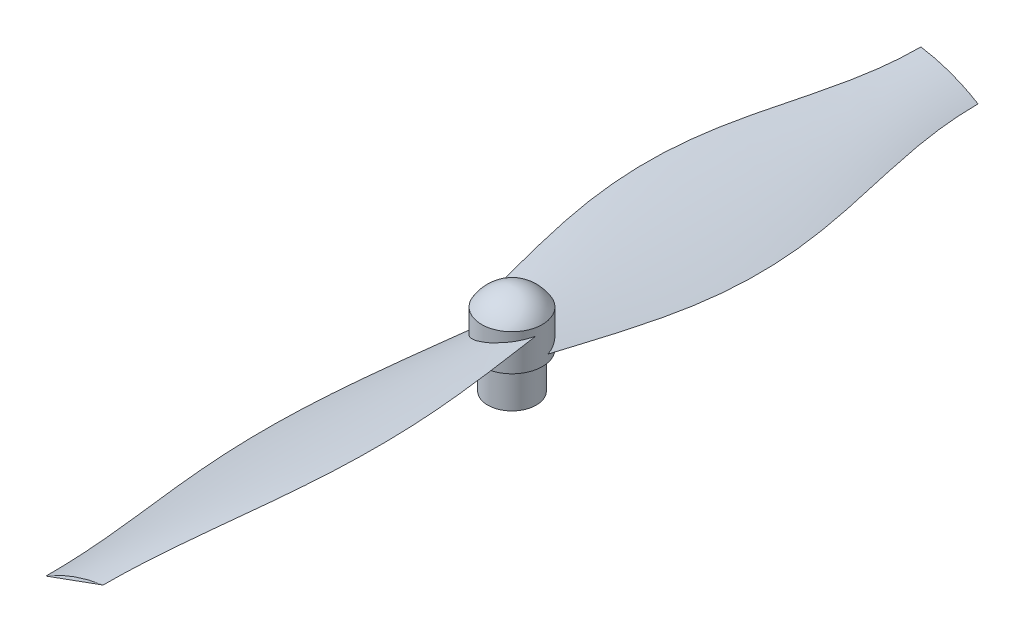
ISO-10303-21;
HEADER;
FILE_DESCRIPTION(('STEP AP214'),'2;1');
FILE_NAME('part.step','',(''),(''),'','','');
FILE_SCHEMA(('AUTOMOTIVE_DESIGN { 1 0 10303 214 1 1 1 1 }'));
ENDSEC;
DATA;
#1=APPLICATION_CONTEXT('core data for automotive mechanical design processes');
#2=APPLICATION_PROTOCOL_DEFINITION('international standard','automotive_design',2000,#1);
#3=PRODUCT_CONTEXT('',#1,'mechanical');
#4=PRODUCT('Part','Part','',(#3));
#5=PRODUCT_RELATED_PRODUCT_CATEGORY('part','',(#4));
#6=PRODUCT_DEFINITION_FORMATION('','',#4);
#7=PRODUCT_DEFINITION_CONTEXT('part definition',#1,'design');
#8=PRODUCT_DEFINITION('design','',#6,#7);
#9=PRODUCT_DEFINITION_SHAPE('','',#8);
#10=(LENGTH_UNIT() NAMED_UNIT(*) SI_UNIT(.MILLI.,.METRE.));
#11=(NAMED_UNIT(*) PLANE_ANGLE_UNIT() SI_UNIT($,.RADIAN.));
#12=(NAMED_UNIT(*) SI_UNIT($,.STERADIAN.) SOLID_ANGLE_UNIT());
#13=UNCERTAINTY_MEASURE_WITH_UNIT(LENGTH_MEASURE(1.E-05),#10,'distance_accuracy_value','');
#14=(GEOMETRIC_REPRESENTATION_CONTEXT(3) GLOBAL_UNCERTAINTY_ASSIGNED_CONTEXT((#13)) GLOBAL_UNIT_ASSIGNED_CONTEXT((#10,
#11,#12)) REPRESENTATION_CONTEXT('',''));
#15=CARTESIAN_POINT('',(0.,0.,0.));
#16=DIRECTION('',(0.,0.,1.));
#17=DIRECTION('',(1.,0.,0.));
#18=AXIS2_PLACEMENT_3D('',#15,#16,#17);
#19=CARTESIAN_POINT('',(4.69846310392955,7.28989928337167,0.));
#20=DIRECTION('',(-0.342020143325666,-0.939692620785909,0.));
#21=DIRECTION('',(-0.939692620785909,0.342020143325666,0.));
#22=AXIS2_PLACEMENT_3D('',#19,#20,#21);
#23=PLANE('',#22);
#24=DIRECTION('',(-0.93969262078591,0.342020143325666,0.));
#25=VECTOR('',#24,1.);
#26=CARTESIAN_POINT('',(0.,9.,0.));
#27=LINE('',#26,#25);
#28=CARTESIAN_POINT('',(4.69846310392955,7.28989928337167,0.));
#29=VERTEX_POINT('',#28);
#30=CARTESIAN_POINT('',(-4.69846310392955,10.7101007166283,0.));
#31=VERTEX_POINT('',#30);
#32=EDGE_CURVE('E104',#29,#31,#27,.T.);
#33=ORIENTED_EDGE('',*,*,#32,.T.);
#34=CARTESIAN_POINT('',(-4.69846310392955,10.7101007166283,0.));
#35=CARTESIAN_POINT('',(-4.69846310392955,10.7101007166283,-0.679869268479037));
#36=CARTESIAN_POINT('',(-14.0317929907433,14.1071549820155,-38.1938255790195));
#37=CARTESIAN_POINT('',(-4.69846310392955,10.7101007166283,-54.6154602527929));
#38=CARTESIAN_POINT('',(-4.69846310392955,10.7101007166283,-72.));
#39=B_SPLINE_CURVE_WITH_KNOTS('',3,(#34,#35,#36,#37,#38),.UNSPECIFIED.,.F.,.F.,(4,1,4),(0.,
0.279461519936665,1.),.UNSPECIFIED.);
#40=CARTESIAN_POINT('',(-4.69846310392955,10.7101007166283,-72.));
#41=VERTEX_POINT('',#40);
#42=EDGE_CURVE('E103',#31,#41,#39,.T.);
#43=ORIENTED_EDGE('',*,*,#42,.T.);
#44=DIRECTION('',(0.93969262078591,-0.342020143325666,0.));
#45=VECTOR('',#44,1.);
#46=CARTESIAN_POINT('',(0.,9.,-72.));
#47=LINE('',#46,#45);
#48=CARTESIAN_POINT('',(4.69846310392955,7.28989928337167,-72.));
#49=VERTEX_POINT('',#48);
#50=EDGE_CURVE('E90',#41,#49,#47,.T.);
#51=ORIENTED_EDGE('',*,*,#50,.T.);
#52=CARTESIAN_POINT('',(4.69846310392955,7.28989928337167,0.));
#53=CARTESIAN_POINT('',(4.69846310392955,7.28989928337167,-0.679869268479039));
#54=CARTESIAN_POINT('',(14.0317929907426,3.89284501798445,-38.1938255790197));
#55=CARTESIAN_POINT('',(4.69846310392955,7.28989928337167,-54.615460252793));
#56=CARTESIAN_POINT('',(4.69846310392955,7.28989928337167,-72.));
#57=B_SPLINE_CURVE_WITH_KNOTS('',3,(#52,#53,#54,#55,#56),.UNSPECIFIED.,.F.,.F.,(4,1,4),(0.,
0.279461519936665,1.),.UNSPECIFIED.);
#58=EDGE_CURVE('E102',#49,#29,#57,.F.);
#59=ORIENTED_EDGE('',*,*,#58,.T.);
#60=EDGE_LOOP('',(#33,#43,#51,#59));
#61=FACE_BOUND('',#60,.T.);
#62=ADVANCED_FACE('F71',(#61),#23,.T.);
#63=CARTESIAN_POINT('',(-4.69846310392955,10.7101007166283,0.));
#64=CARTESIAN_POINT('',(-4.69846310392955,10.7101007166283,-0.679869268479037));
#65=CARTESIAN_POINT('',(-14.0317929907433,14.1071549820156,-38.1938255790195));
#66=CARTESIAN_POINT('',(-4.69846310392955,10.7101007166283,-54.6154602527929));
#67=CARTESIAN_POINT('',(-4.69846310392955,10.7101007166283,-72.));
#68=CARTESIAN_POINT('',(-1.36782774232244,10.2145301512131,0.));
#69=CARTESIAN_POINT('',(-1.36782774232244,10.2145301512131,-0.679869268479038));
#70=CARTESIAN_POINT('',(-4.44104676076315,11.3428202206355,-38.1938255790196));
#71=CARTESIAN_POINT('',(-1.36782774232244,10.2145301512131,-54.6154602527929));
#72=CARTESIAN_POINT('',(-1.36782774232244,10.2145301512131,-72.));
#73=CARTESIAN_POINT('',(1.82850177394058,9.05116134838689,0.));
#74=CARTESIAN_POINT('',(1.82850177394058,9.05116134838689,-0.679869268479038));
#75=CARTESIAN_POINT('',(4.90797500226109,7.94005457938779,-38.1938255790196));
#76=CARTESIAN_POINT('',(1.82850177394058,9.05116134838688,-54.6154602527929));
#77=CARTESIAN_POINT('',(1.82850177394058,9.05116134838688,-72.));
#78=CARTESIAN_POINT('',(4.69846310392955,7.28989928337168,0.));
#79=CARTESIAN_POINT('',(4.69846310392955,7.28989928337168,-0.679869268479039));
#80=CARTESIAN_POINT('',(14.0317929907426,3.8928450179845,-38.1938255790197));
#81=CARTESIAN_POINT('',(4.69846310392955,7.28989928337167,-54.615460252793));
#82=CARTESIAN_POINT('',(4.69846310392955,7.28989928337167,-72.));
#83=B_SPLINE_SURFACE_WITH_KNOTS('',3,3,((#63,#64,#65,#66,#67),(#68,#69,#70,#71,#72),(#73,#74,
#75,#76,#77),(#78,#79,#80,#81,#82)),.UNSPECIFIED.,.F.,.F.,.F.,(4,4),(4,1,4),(0.,1.),(0.,
0.279461519936665,1.),.UNSPECIFIED.);
#84=CARTESIAN_POINT('',(-4.69846310392955,10.7101007166283,0.));
#85=CARTESIAN_POINT('',(-1.36782774232244,10.2145301512131,0.));
#86=CARTESIAN_POINT('',(1.82850177394058,9.05116134838689,0.));
#87=CARTESIAN_POINT('',(4.69846310392955,7.28989928337168,0.));
#88=B_SPLINE_CURVE_WITH_KNOTS('',3,(#84,#85,#86,#87),.UNSPECIFIED.,.F.,.F.,(4,4),(0.,1.),.UNSPECIFIED.);
#89=EDGE_CURVE('E13',#31,#29,#88,.T.);
#90=CARTESIAN_POINT('',(-4.69846310392955,10.7101007166283,-72.));
#91=CARTESIAN_POINT('',(-1.36782774232244,10.2145301512131,-72.));
#92=CARTESIAN_POINT('',(1.82850177394058,9.05116134838688,-72.));
#93=CARTESIAN_POINT('',(4.69846310392955,7.28989928337167,-72.));
#94=B_SPLINE_CURVE_WITH_KNOTS('',3,(#90,#91,#92,#93),.UNSPECIFIED.,.F.,.F.,(4,4),(0.,1.),.UNSPECIFIED.);
#95=EDGE_CURVE('E76',#49,#41,#94,.F.);
#96=ORIENTED_EDGE('',*,*,#89,.T.);
#97=ORIENTED_EDGE('',*,*,#58,.F.);
#98=ORIENTED_EDGE('',*,*,#95,.T.);
#99=ORIENTED_EDGE('',*,*,#42,.F.);
#100=EDGE_LOOP('',(#96,#97,#98,#99));
#101=FACE_BOUND('',#100,.T.);
#102=ADVANCED_FACE('F72',(#101),#83,.T.);
#103=OPEN_SHELL('',(#62,#102));
#104=SHELL_BASED_SURFACE_MODEL('B2',(#103));
#105=CARTESIAN_POINT('',(-4.69846310392953,7.28989928337163,0.));
#106=DIRECTION('',(0.342020143325674,-0.939692620785907,0.));
#107=DIRECTION('',(0.939692620785907,0.342020143325674,0.));
#108=AXIS2_PLACEMENT_3D('',#105,#106,#107);
#109=PLANE('',#108);
#110=DIRECTION('',(0.939692620785906,0.342020143325674,0.));
#111=VECTOR('',#110,1.);
#112=CARTESIAN_POINT('',(0.,9.,0.));
#113=LINE('',#112,#111);
#114=CARTESIAN_POINT('',(-4.69846310392953,7.28989928337163,0.));
#115=VERTEX_POINT('',#114);
#116=CARTESIAN_POINT('',(4.69846310392953,10.7101007166284,0.));
#117=VERTEX_POINT('',#116);
#118=EDGE_CURVE('E203',#115,#117,#113,.T.);
#119=ORIENTED_EDGE('',*,*,#118,.T.);
#120=CARTESIAN_POINT('',(4.69846310392953,10.7101007166284,0.));
#121=CARTESIAN_POINT('',(4.69846310392953,10.7101007166284,0.679869268479038));
#122=CARTESIAN_POINT('',(14.031792990743,14.1071549820155,38.1938255790196));
#123=CARTESIAN_POINT('',(4.69846310392954,10.7101007166283,54.6154602527929));
#124=CARTESIAN_POINT('',(4.69846310392954,10.7101007166283,72.));
#125=B_SPLINE_CURVE_WITH_KNOTS('',3,(#120,#121,#122,#123,#124),.UNSPECIFIED.,.F.,.F.,(4,1,4),
(0.,0.279461519936665,1.),.UNSPECIFIED.);
#126=CARTESIAN_POINT('',(4.69846310392954,10.7101007166283,72.));
#127=VERTEX_POINT('',#126);
#128=EDGE_CURVE('E202',#117,#127,#125,.T.);
#129=ORIENTED_EDGE('',*,*,#128,.T.);
#130=DIRECTION('',(-0.939692620785909,-0.342020143325667,0.));
#131=VECTOR('',#130,1.);
#132=CARTESIAN_POINT('',(0.,9.,72.));
#133=LINE('',#132,#131);
#134=CARTESIAN_POINT('',(-4.69846310392955,7.28989928337167,72.));
#135=VERTEX_POINT('',#134);
#136=EDGE_CURVE('E189',#127,#135,#133,.T.);
#137=ORIENTED_EDGE('',*,*,#136,.T.);
#138=CARTESIAN_POINT('',(-4.69846310392953,7.28989928337163,0.));
#139=CARTESIAN_POINT('',(-4.69846310392953,7.28989928337163,0.679869268479038));
#140=CARTESIAN_POINT('',(-14.031792990743,3.8928450179845,38.1938255790196));
#141=CARTESIAN_POINT('',(-4.69846310392955,7.28989928337167,54.6154602527929));
#142=CARTESIAN_POINT('',(-4.69846310392955,7.28989928337167,72.));
#143=B_SPLINE_CURVE_WITH_KNOTS('',3,(#138,#139,#140,#141,#142),.UNSPECIFIED.,.F.,.F.,(4,1,4),
(0.,0.279461519936665,1.),.UNSPECIFIED.);
#144=EDGE_CURVE('E201',#135,#115,#143,.F.);
#145=ORIENTED_EDGE('',*,*,#144,.T.);
#146=EDGE_LOOP('',(#119,#129,#137,#145));
#147=FACE_BOUND('',#146,.T.);
#148=ADVANCED_FACE('F170',(#147),#109,.T.);
#149=CARTESIAN_POINT('',(4.69846310392955,10.7101007166284,0.));
#150=CARTESIAN_POINT('',(4.69846310392955,10.7101007166284,0.679869268479038));
#151=CARTESIAN_POINT('',(14.031792990743,14.1071549820155,38.1938255790196));
#152=CARTESIAN_POINT('',(4.69846310392954,10.7101007166283,54.6154602527929));
#153=CARTESIAN_POINT('',(4.69846310392954,10.7101007166283,72.));
#154=CARTESIAN_POINT('',(1.36782774232244,10.2145301512131,0.));
#155=CARTESIAN_POINT('',(1.36782774232244,10.2145301512131,0.679869268479038));
#156=CARTESIAN_POINT('',(4.4410467607628,11.3428202206355,38.1938255790196));
#157=CARTESIAN_POINT('',(1.36782774232244,10.2145301512131,54.6154602527929));
#158=CARTESIAN_POINT('',(1.36782774232244,10.2145301512131,72.));
#159=CARTESIAN_POINT('',(-1.82850177394057,9.05116134838688,0.));
#160=CARTESIAN_POINT('',(-1.82850177394057,9.05116134838688,0.679869268479038));
#161=CARTESIAN_POINT('',(-4.90797500226145,7.94005457938776,38.1938255790196));
#162=CARTESIAN_POINT('',(-1.82850177394058,9.05116134838689,54.6154602527929));
#163=CARTESIAN_POINT('',(-1.82850177394058,9.05116134838689,72.));
#164=CARTESIAN_POINT('',(-4.69846310392952,7.28989928337164,0.));
#165=CARTESIAN_POINT('',(-4.69846310392952,7.28989928337164,0.679869268479038));
#166=CARTESIAN_POINT('',(-14.031792990743,3.89284501798451,38.1938255790196));
#167=CARTESIAN_POINT('',(-4.69846310392954,7.28989928337168,54.6154602527929));
#168=CARTESIAN_POINT('',(-4.69846310392954,7.28989928337168,72.));
#169=B_SPLINE_SURFACE_WITH_KNOTS('',3,3,((#149,#150,#151,#152,#153),(#154,#155,#156,#157,#158),
(#159,#160,#161,#162,#163),(#164,#165,#166,#167,#168)),.UNSPECIFIED.,.F.,.F.,.F.,(4,4),(4,1,4),
(0.,1.),(0.,0.279461519936665,1.),.UNSPECIFIED.);
#170=CARTESIAN_POINT('',(4.69846310392955,10.7101007166284,0.));
#171=CARTESIAN_POINT('',(1.36782774232244,10.2145301512131,0.));
#172=CARTESIAN_POINT('',(-1.82850177394057,9.05116134838688,0.));
#173=CARTESIAN_POINT('',(-4.69846310392952,7.28989928337164,0.));
#174=B_SPLINE_CURVE_WITH_KNOTS('',3,(#170,#171,#172,#173),.UNSPECIFIED.,.F.,.F.,(4,4),(0.,1.),.UNSPECIFIED.);
#175=EDGE_CURVE('E69',#117,#115,#174,.T.);
#176=CARTESIAN_POINT('',(4.69846310392954,10.7101007166283,72.));
#177=CARTESIAN_POINT('',(1.36782774232244,10.2145301512131,72.));
#178=CARTESIAN_POINT('',(-1.82850177394058,9.05116134838689,72.));
#179=CARTESIAN_POINT('',(-4.69846310392954,7.28989928337168,72.));
#180=B_SPLINE_CURVE_WITH_KNOTS('',3,(#176,#177,#178,#179),.UNSPECIFIED.,.F.,.F.,(4,4),(0.,1.),.UNSPECIFIED.);
#181=EDGE_CURVE('E175',#135,#127,#180,.F.);
#182=ORIENTED_EDGE('',*,*,#175,.T.);
#183=ORIENTED_EDGE('',*,*,#144,.F.);
#184=ORIENTED_EDGE('',*,*,#181,.T.);
#185=ORIENTED_EDGE('',*,*,#128,.F.);
#186=EDGE_LOOP('',(#182,#183,#184,#185));
#187=FACE_BOUND('',#186,.T.);
#188=ADVANCED_FACE('F171',(#187),#169,.T.);
#189=OPEN_SHELL('',(#148,#188));
#190=SHELL_BASED_SURFACE_MODEL('B7',(#189));
#191=CARTESIAN_POINT('',(0.,0.,0.));
#192=DIRECTION('',(0.,-1.,0.));
#193=DIRECTION('',(0.,0.,-1.));
#194=AXIS2_PLACEMENT_3D('',#191,#192,#193);
#195=PLANE('',#194);
#196=DIRECTION('',(0.5,0.,0.866025403784439));
#197=VECTOR('',#196,1.);
#198=CARTESIAN_POINT('',(1.44337567297407,0.,-2.5));
#199=LINE('',#198,#197);
#200=CARTESIAN_POINT('',(1.44337567297407,0.,-2.5));
#201=VERTEX_POINT('',#200);
#202=CARTESIAN_POINT('',(2.88675134594813,0.,0.));
#203=VERTEX_POINT('',#202);
#204=EDGE_CURVE('E274',#201,#203,#199,.T.);
#205=ORIENTED_EDGE('',*,*,#204,.F.);
#206=DIRECTION('',(1.,0.,0.));
#207=VECTOR('',#206,1.);
#208=CARTESIAN_POINT('',(-1.44337567297406,0.,-2.5));
#209=LINE('',#208,#207);
#210=CARTESIAN_POINT('',(-1.44337567297406,0.,-2.5));
#211=VERTEX_POINT('',#210);
#212=EDGE_CURVE('E333',#211,#201,#209,.T.);
#213=ORIENTED_EDGE('',*,*,#212,.F.);
#214=DIRECTION('',(0.5,0.,-0.866025403784438));
#215=VECTOR('',#214,1.);
#216=CARTESIAN_POINT('',(-2.88675134594813,0.,0.));
#217=LINE('',#216,#215);
#218=CARTESIAN_POINT('',(-2.88675134594813,0.,0.));
#219=VERTEX_POINT('',#218);
#220=EDGE_CURVE('E336',#219,#211,#217,.T.);
#221=ORIENTED_EDGE('',*,*,#220,.F.);
#222=DIRECTION('',(-0.5,0.,-0.866025403784438));
#223=VECTOR('',#222,1.);
#224=CARTESIAN_POINT('',(-1.44337567297406,0.,2.5));
#225=LINE('',#224,#223);
#226=CARTESIAN_POINT('',(-1.44337567297406,0.,2.5));
#227=VERTEX_POINT('',#226);
#228=EDGE_CURVE('E352',#227,#219,#225,.T.);
#229=ORIENTED_EDGE('',*,*,#228,.F.);
#230=DIRECTION('',(-1.,0.,0.));
#231=VECTOR('',#230,1.);
#232=CARTESIAN_POINT('',(1.44337567297406,0.,2.5));
#233=LINE('',#232,#231);
#234=CARTESIAN_POINT('',(1.44337567297406,0.,2.5));
#235=VERTEX_POINT('',#234);
#236=EDGE_CURVE('E349',#235,#227,#233,.T.);
#237=ORIENTED_EDGE('',*,*,#236,.F.);
#238=DIRECTION('',(-0.5,0.,0.866025403784438));
#239=VECTOR('',#238,1.);
#240=CARTESIAN_POINT('',(2.88675134594813,0.,0.));
#241=LINE('',#240,#239);
#242=EDGE_CURVE('E347',#203,#235,#241,.T.);
#243=ORIENTED_EDGE('',*,*,#242,.F.);
#244=EDGE_LOOP('',(#205,#213,#221,#229,#237,#243));
#245=FACE_BOUND('',#244,.T.);
#246=CARTESIAN_POINT('',(0.,0.,0.));
#247=DIRECTION('',(0.,-1.,0.));
#248=DIRECTION('',(0.,0.,-1.));
#249=AXIS2_PLACEMENT_3D('',#246,#247,#248);
#250=CIRCLE('',#249,4.);
#251=CARTESIAN_POINT('',(0.,0.,-4.));
#252=VERTEX_POINT('',#251);
#253=EDGE_CURVE('E359',#252,#252,#250,.T.);
#254=ORIENTED_EDGE('',*,*,#253,.T.);
#255=EDGE_LOOP('',(#254));
#256=FACE_BOUND('',#255,.T.);
#257=ADVANCED_FACE('F260',(#245,#256),#195,.T.);
#258=CARTESIAN_POINT('',(0.,9.00326916134687,0.19803850319188));
#259=DIRECTION('',(-1.,0.,0.));
#260=DIRECTION('',(0.,0.,-1.));
#261=AXIS2_PLACEMENT_3D('',#258,#259,#260);
#262=CIRCLE('',#261,6.);
#263=TRIMMED_CURVE('',#262,(PARAMETER_VALUE(-1.53778391366149)),
(PARAMETER_VALUE(1.53778391366149)),.T.,.PARAMETER.);
#264=CARTESIAN_POINT('',(0.,9.00326916134687,0.));
#265=DIRECTION('',(0.,-1.,0.));
#266=AXIS1_PLACEMENT('',#264,#265);
#267=SURFACE_OF_REVOLUTION('',#263,#266);
#268=CARTESIAN_POINT('',(0.,15.,0.));
#269=VERTEX_POINT('',#268);
#270=VERTEX_LOOP('',#269);
#271=FACE_BOUND('',#270,.T.);
#272=CARTESIAN_POINT('',(0.,12.,0.));
#273=DIRECTION('',(0.,-1.,0.));
#274=DIRECTION('',(0.,0.,-1.));
#275=AXIS2_PLACEMENT_3D('',#272,#273,#274);
#276=CIRCLE('',#275,5.);
#277=CARTESIAN_POINT('',(0.,12.,-5.));
#278=VERTEX_POINT('',#277);
#279=EDGE_CURVE('E168',#278,#278,#276,.T.);
#280=ORIENTED_EDGE('',*,*,#279,.F.);
#281=EDGE_LOOP('',(#280));
#282=FACE_BOUND('',#281,.T.);
#283=ADVANCED_FACE('F379',(#271,#282),#267,.T.);
#284=CARTESIAN_POINT('',(0.,0.,0.));
#285=DIRECTION('',(0.,-1.,0.));
#286=DIRECTION('',(0.,0.,-1.));
#287=AXIS2_PLACEMENT_3D('',#284,#285,#286);
#288=CYLINDRICAL_SURFACE('',#287,5.);
#289=ORIENTED_EDGE('',*,*,#279,.T.);
#290=EDGE_LOOP('',(#289));
#291=FACE_BOUND('',#290,.T.);
#292=CARTESIAN_POINT('',(0.,6.,0.));
#293=DIRECTION('',(0.,-1.,0.));
#294=DIRECTION('',(0.,0.,-1.));
#295=AXIS2_PLACEMENT_3D('',#292,#293,#294);
#296=CIRCLE('',#295,5.);
#297=CARTESIAN_POINT('',(0.,6.,-5.));
#298=VERTEX_POINT('',#297);
#299=EDGE_CURVE('E267',#298,#298,#296,.T.);
#300=ORIENTED_EDGE('',*,*,#299,.F.);
#301=EDGE_LOOP('',(#300));
#302=FACE_BOUND('',#301,.T.);
#303=ADVANCED_FACE('F377',(#291,#302),#288,.T.);
#304=CARTESIAN_POINT('',(4.,6.,0.));
#305=DIRECTION('',(0.,-1.,0.));
#306=DIRECTION('',(0.,0.,-1.));
#307=AXIS2_PLACEMENT_3D('',#304,#305,#306);
#308=PLANE('',#307);
#309=ORIENTED_EDGE('',*,*,#299,.T.);
#310=EDGE_LOOP('',(#309));
#311=FACE_BOUND('',#310,.T.);
#312=CARTESIAN_POINT('',(0.,6.,0.));
#313=DIRECTION('',(0.,-1.,0.));
#314=DIRECTION('',(0.,0.,-1.));
#315=AXIS2_PLACEMENT_3D('',#312,#313,#314);
#316=CIRCLE('',#315,4.);
#317=CARTESIAN_POINT('',(0.,6.,-4.));
#318=VERTEX_POINT('',#317);
#319=EDGE_CURVE('E369',#318,#318,#316,.T.);
#320=ORIENTED_EDGE('',*,*,#319,.F.);
#321=EDGE_LOOP('',(#320));
#322=FACE_BOUND('',#321,.T.);
#323=ADVANCED_FACE('F374',(#311,#322),#308,.T.);
#324=CARTESIAN_POINT('',(0.,0.,0.));
#325=DIRECTION('',(0.,-1.,0.));
#326=DIRECTION('',(0.,0.,-1.));
#327=AXIS2_PLACEMENT_3D('',#324,#325,#326);
#328=CYLINDRICAL_SURFACE('',#327,4.);
#329=ORIENTED_EDGE('',*,*,#319,.T.);
#330=EDGE_LOOP('',(#329));
#331=FACE_BOUND('',#330,.T.);
#332=ORIENTED_EDGE('',*,*,#253,.F.);
#333=EDGE_LOOP('',(#332));
#334=FACE_BOUND('',#333,.T.);
#335=ADVANCED_FACE('F386',(#331,#334),#328,.T.);
#336=CARTESIAN_POINT('',(1.44337567297407,7.,-2.5));
#337=DIRECTION('',(0.866025403784438,0.,-0.5));
#338=DIRECTION('',(-0.5,0.,-0.866025403784439));
#339=AXIS2_PLACEMENT_3D('',#336,#337,#338);
#340=PLANE('',#339);
#341=ORIENTED_EDGE('',*,*,#204,.T.);
#342=DIRECTION('',(0.,-1.,0.));
#343=VECTOR('',#342,1.);
#344=CARTESIAN_POINT('',(2.88675134594813,7.,0.));
#345=LINE('',#344,#343);
#346=CARTESIAN_POINT('',(2.88675134594813,7.,0.));
#347=VERTEX_POINT('',#346);
#348=EDGE_CURVE('E310',#347,#203,#345,.T.);
#349=ORIENTED_EDGE('',*,*,#348,.F.);
#350=DIRECTION('',(0.5,0.,0.866025403784439));
#351=VECTOR('',#350,1.);
#352=CARTESIAN_POINT('',(1.44337567297407,7.,-2.5));
#353=LINE('',#352,#351);
#354=CARTESIAN_POINT('',(1.44337567297407,7.,-2.5));
#355=VERTEX_POINT('',#354);
#356=EDGE_CURVE('E314',#355,#347,#353,.T.);
#357=ORIENTED_EDGE('',*,*,#356,.F.);
#358=DIRECTION('',(0.,-1.,0.));
#359=VECTOR('',#358,1.);
#360=CARTESIAN_POINT('',(1.44337567297407,7.,-2.5));
#361=LINE('',#360,#359);
#362=EDGE_CURVE('E357',#355,#201,#361,.T.);
#363=ORIENTED_EDGE('',*,*,#362,.T.);
#364=EDGE_LOOP('',(#341,#349,#357,#363));
#365=FACE_BOUND('',#364,.T.);
#366=ADVANCED_FACE('F312',(#365),#340,.F.);
#367=CARTESIAN_POINT('',(-1.44337567297406,7.,-2.5));
#368=DIRECTION('',(0.,0.,-1.));
#369=DIRECTION('',(-1.,0.,0.));
#370=AXIS2_PLACEMENT_3D('',#367,#368,#369);
#371=PLANE('',#370);
#372=ORIENTED_EDGE('',*,*,#212,.T.);
#373=ORIENTED_EDGE('',*,*,#362,.F.);
#374=DIRECTION('',(1.,0.,0.));
#375=VECTOR('',#374,1.);
#376=CARTESIAN_POINT('',(-1.44337567297406,7.,-2.5));
#377=LINE('',#376,#375);
#378=CARTESIAN_POINT('',(-1.44337567297406,7.,-2.5));
#379=VERTEX_POINT('',#378);
#380=EDGE_CURVE('E320',#379,#355,#377,.T.);
#381=ORIENTED_EDGE('',*,*,#380,.F.);
#382=DIRECTION('',(0.,-1.,0.));
#383=VECTOR('',#382,1.);
#384=CARTESIAN_POINT('',(-1.44337567297406,7.,-2.5));
#385=LINE('',#384,#383);
#386=EDGE_CURVE('E360',#379,#211,#385,.T.);
#387=ORIENTED_EDGE('',*,*,#386,.T.);
#388=EDGE_LOOP('',(#372,#373,#381,#387));
#389=FACE_BOUND('',#388,.T.);
#390=ADVANCED_FACE('F402',(#389),#371,.F.);
#391=CARTESIAN_POINT('',(-2.88675134594813,7.,0.));
#392=DIRECTION('',(-0.866025403784438,0.,-0.5));
#393=DIRECTION('',(-0.5,0.,0.866025403784438));
#394=AXIS2_PLACEMENT_3D('',#391,#392,#393);
#395=PLANE('',#394);
#396=ORIENTED_EDGE('',*,*,#220,.T.);
#397=ORIENTED_EDGE('',*,*,#386,.F.);
#398=DIRECTION('',(0.5,0.,-0.866025403784438));
#399=VECTOR('',#398,1.);
#400=CARTESIAN_POINT('',(-2.88675134594813,7.,0.));
#401=LINE('',#400,#399);
#402=CARTESIAN_POINT('',(-2.88675134594813,7.,0.));
#403=VERTEX_POINT('',#402);
#404=EDGE_CURVE('E343',#403,#379,#401,.T.);
#405=ORIENTED_EDGE('',*,*,#404,.F.);
#406=DIRECTION('',(0.,-1.,0.));
#407=VECTOR('',#406,1.);
#408=CARTESIAN_POINT('',(-2.88675134594813,7.,0.));
#409=LINE('',#408,#407);
#410=EDGE_CURVE('E362',#403,#219,#409,.T.);
#411=ORIENTED_EDGE('',*,*,#410,.T.);
#412=EDGE_LOOP('',(#396,#397,#405,#411));
#413=FACE_BOUND('',#412,.T.);
#414=ADVANCED_FACE('F414',(#413),#395,.F.);
#415=CARTESIAN_POINT('',(-1.44337567297406,7.,2.5));
#416=DIRECTION('',(-0.866025403784438,0.,0.5));
#417=DIRECTION('',(0.5,0.,0.866025403784439));
#418=AXIS2_PLACEMENT_3D('',#415,#416,#417);
#419=PLANE('',#418);
#420=ORIENTED_EDGE('',*,*,#228,.T.);
#421=ORIENTED_EDGE('',*,*,#410,.F.);
#422=DIRECTION('',(-0.5,0.,-0.866025403784438));
#423=VECTOR('',#422,1.);
#424=CARTESIAN_POINT('',(-1.44337567297406,7.,2.5));
#425=LINE('',#424,#423);
#426=CARTESIAN_POINT('',(-1.44337567297406,7.,2.5));
#427=VERTEX_POINT('',#426);
#428=EDGE_CURVE('E340',#427,#403,#425,.T.);
#429=ORIENTED_EDGE('',*,*,#428,.F.);
#430=DIRECTION('',(0.,-1.,0.));
#431=VECTOR('',#430,1.);
#432=CARTESIAN_POINT('',(-1.44337567297406,7.,2.5));
#433=LINE('',#432,#431);
#434=EDGE_CURVE('E364',#427,#227,#433,.T.);
#435=ORIENTED_EDGE('',*,*,#434,.T.);
#436=EDGE_LOOP('',(#420,#421,#429,#435));
#437=FACE_BOUND('',#436,.T.);
#438=ADVANCED_FACE('F410',(#437),#419,.F.);
#439=CARTESIAN_POINT('',(1.44337567297406,7.,2.5));
#440=DIRECTION('',(0.,0.,1.));
#441=DIRECTION('',(1.,0.,0.));
#442=AXIS2_PLACEMENT_3D('',#439,#440,#441);
#443=PLANE('',#442);
#444=ORIENTED_EDGE('',*,*,#236,.T.);
#445=ORIENTED_EDGE('',*,*,#434,.F.);
#446=DIRECTION('',(-1.,0.,0.));
#447=VECTOR('',#446,1.);
#448=CARTESIAN_POINT('',(1.44337567297406,7.,2.5));
#449=LINE('',#448,#447);
#450=CARTESIAN_POINT('',(1.44337567297406,7.,2.5));
#451=VERTEX_POINT('',#450);
#452=EDGE_CURVE('E328',#451,#427,#449,.T.);
#453=ORIENTED_EDGE('',*,*,#452,.F.);
#454=DIRECTION('',(0.,-1.,0.));
#455=VECTOR('',#454,1.);
#456=CARTESIAN_POINT('',(1.44337567297406,7.,2.5));
#457=LINE('',#456,#455);
#458=EDGE_CURVE('E319',#451,#235,#457,.T.);
#459=ORIENTED_EDGE('',*,*,#458,.T.);
#460=EDGE_LOOP('',(#444,#445,#453,#459));
#461=FACE_BOUND('',#460,.T.);
#462=ADVANCED_FACE('F407',(#461),#443,.F.);
#463=CARTESIAN_POINT('',(2.88675134594813,7.,0.));
#464=DIRECTION('',(0.866025403784438,0.,0.5));
#465=DIRECTION('',(0.5,0.,-0.866025403784438));
#466=AXIS2_PLACEMENT_3D('',#463,#464,#465);
#467=PLANE('',#466);
#468=ORIENTED_EDGE('',*,*,#242,.T.);
#469=ORIENTED_EDGE('',*,*,#458,.F.);
#470=DIRECTION('',(-0.5,0.,0.866025403784438));
#471=VECTOR('',#470,1.);
#472=CARTESIAN_POINT('',(2.88675134594813,7.,0.));
#473=LINE('',#472,#471);
#474=EDGE_CURVE('E323',#347,#451,#473,.T.);
#475=ORIENTED_EDGE('',*,*,#474,.F.);
#476=ORIENTED_EDGE('',*,*,#348,.T.);
#477=EDGE_LOOP('',(#468,#469,#475,#476));
#478=FACE_BOUND('',#477,.T.);
#479=ADVANCED_FACE('F324',(#478),#467,.F.);
#480=CARTESIAN_POINT('',(0.,7.,0.));
#481=DIRECTION('',(0.,-1.,0.));
#482=DIRECTION('',(0.,0.,-1.));
#483=AXIS2_PLACEMENT_3D('',#480,#481,#482);
#484=PLANE('',#483);
#485=ORIENTED_EDGE('',*,*,#356,.T.);
#486=ORIENTED_EDGE('',*,*,#474,.T.);
#487=ORIENTED_EDGE('',*,*,#452,.T.);
#488=ORIENTED_EDGE('',*,*,#428,.T.);
#489=ORIENTED_EDGE('',*,*,#404,.T.);
#490=ORIENTED_EDGE('',*,*,#380,.T.);
#491=EDGE_LOOP('',(#485,#486,#487,#488,#489,#490));
#492=FACE_BOUND('',#491,.T.);
#493=ADVANCED_FACE('F330',(#492),#484,.T.);
#494=CLOSED_SHELL('',(#257,#283,#303,#323,#335,#366,#390,#414,#438,#462,#479,#493));
#495=MANIFOLD_SOLID_BREP('B63',#494);
#496=ADVANCED_BREP_SHAPE_REPRESENTATION('',(#18,#495),#14);
#497=MANIFOLD_SURFACE_SHAPE_REPRESENTATION('',(#18,#104,#190),#14);
#498=SHAPE_REPRESENTATION('',(#18),#14);
#499=SHAPE_DEFINITION_REPRESENTATION(#9,#498);
#500=SHAPE_REPRESENTATION_RELATIONSHIP('','',#498,#496);
#501=SHAPE_REPRESENTATION_RELATIONSHIP('','',#498,#497);
ENDSEC;
END-ISO-10303-21;
